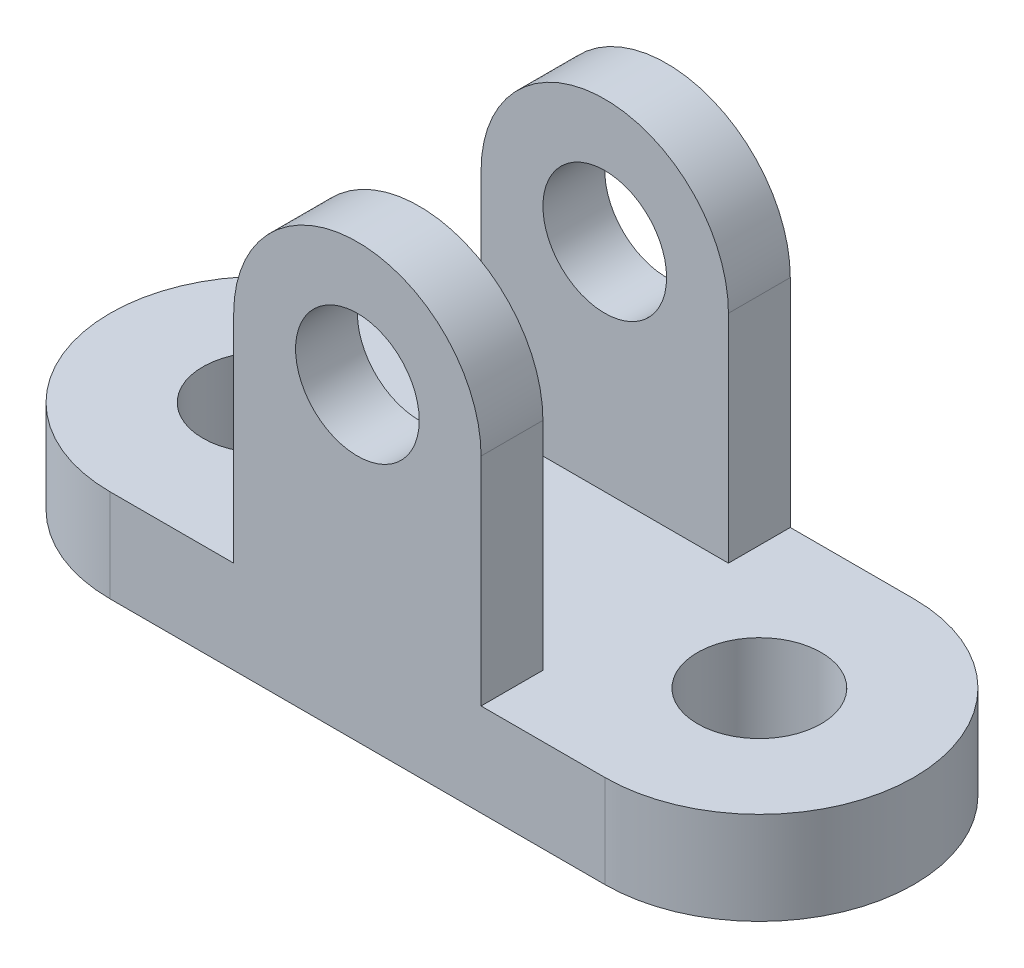
ISO-10303-21;
HEADER;
FILE_DESCRIPTION(('STEP AP214'),'2;1');
FILE_NAME('part.step','',(''),(''),'','','');
FILE_SCHEMA(('AUTOMOTIVE_DESIGN { 1 0 10303 214 1 1 1 1 }'));
ENDSEC;
DATA;
#1=APPLICATION_CONTEXT('core data for automotive mechanical design processes');
#2=APPLICATION_PROTOCOL_DEFINITION('international standard','automotive_design',2000,#1);
#3=PRODUCT_CONTEXT('',#1,'mechanical');
#4=PRODUCT('Part','Part','',(#3));
#5=PRODUCT_RELATED_PRODUCT_CATEGORY('part','',(#4));
#6=PRODUCT_DEFINITION_FORMATION('','',#4);
#7=PRODUCT_DEFINITION_CONTEXT('part definition',#1,'design');
#8=PRODUCT_DEFINITION('design','',#6,#7);
#9=PRODUCT_DEFINITION_SHAPE('','',#8);
#10=(LENGTH_UNIT() NAMED_UNIT(*) SI_UNIT(.MILLI.,.METRE.));
#11=(NAMED_UNIT(*) PLANE_ANGLE_UNIT() SI_UNIT($,.RADIAN.));
#12=(NAMED_UNIT(*) SI_UNIT($,.STERADIAN.) SOLID_ANGLE_UNIT());
#13=UNCERTAINTY_MEASURE_WITH_UNIT(LENGTH_MEASURE(1.E-05),#10,'distance_accuracy_value','');
#14=(GEOMETRIC_REPRESENTATION_CONTEXT(3) GLOBAL_UNCERTAINTY_ASSIGNED_CONTEXT((#13)) GLOBAL_UNIT_ASSIGNED_CONTEXT((#10,
#11,#12)) REPRESENTATION_CONTEXT('',''));
#15=CARTESIAN_POINT('',(0.,0.,0.));
#16=DIRECTION('',(0.,0.,1.));
#17=DIRECTION('',(1.,0.,0.));
#18=AXIS2_PLACEMENT_3D('',#15,#16,#17);
#19=CARTESIAN_POINT('',(0.,50.,-25.));
#20=DIRECTION('',(0.,0.,-1.));
#21=DIRECTION('',(-1.,0.,0.));
#22=AXIS2_PLACEMENT_3D('',#19,#20,#21);
#23=CYLINDRICAL_SURFACE('',#22,20.);
#24=CARTESIAN_POINT('',(0.,50.,15.));
#25=DIRECTION('',(0.,0.,-1.));
#26=DIRECTION('',(-1.,0.,0.));
#27=AXIS2_PLACEMENT_3D('',#24,#25,#26);
#28=CIRCLE('',#27,20.);
#29=CARTESIAN_POINT('',(20.,50.,15.));
#30=VERTEX_POINT('',#29);
#31=CARTESIAN_POINT('',(-20.,50.,15.));
#32=VERTEX_POINT('',#31);
#33=EDGE_CURVE('E271',#30,#32,#28,.F.);
#34=ORIENTED_EDGE('',*,*,#33,.T.);
#35=DIRECTION('',(0.,0.,-1.));
#36=VECTOR('',#35,1.);
#37=CARTESIAN_POINT('',(-20.,50.,25.));
#38=LINE('',#37,#36);
#39=CARTESIAN_POINT('',(-20.,50.,25.));
#40=VERTEX_POINT('',#39);
#41=EDGE_CURVE('E227',#40,#32,#38,.T.);
#42=ORIENTED_EDGE('',*,*,#41,.F.);
#43=CARTESIAN_POINT('',(0.,50.,25.));
#44=DIRECTION('',(0.,0.,-1.));
#45=DIRECTION('',(-1.,0.,0.));
#46=AXIS2_PLACEMENT_3D('',#43,#44,#45);
#47=CIRCLE('',#46,20.);
#48=CARTESIAN_POINT('',(20.,50.,25.));
#49=VERTEX_POINT('',#48);
#50=EDGE_CURVE('E71',#49,#40,#47,.F.);
#51=ORIENTED_EDGE('',*,*,#50,.F.);
#52=DIRECTION('',(0.,0.,-1.));
#53=VECTOR('',#52,1.);
#54=CARTESIAN_POINT('',(20.,50.,25.));
#55=LINE('',#54,#53);
#56=EDGE_CURVE('E223',#30,#49,#55,.F.);
#57=ORIENTED_EDGE('',*,*,#56,.F.);
#58=EDGE_LOOP('',(#34,#42,#51,#57));
#59=FACE_BOUND('',#58,.T.);
#60=ADVANCED_FACE('F47',(#59),#23,.T.);
#61=CARTESIAN_POINT('',(0.,50.,-15.));
#62=DIRECTION('',(0.,0.,1.));
#63=DIRECTION('',(1.,0.,0.));
#64=AXIS2_PLACEMENT_3D('',#61,#62,#63);
#65=CIRCLE('',#64,20.);
#66=CARTESIAN_POINT('',(-20.,50.,-15.));
#67=VERTEX_POINT('',#66);
#68=CARTESIAN_POINT('',(20.,50.,-15.));
#69=VERTEX_POINT('',#68);
#70=EDGE_CURVE('E148',#67,#69,#65,.F.);
#71=ORIENTED_EDGE('',*,*,#70,.T.);
#72=CARTESIAN_POINT('',(20.,50.,-25.));
#73=VERTEX_POINT('',#72);
#74=EDGE_CURVE('E156',#73,#69,#55,.F.);
#75=ORIENTED_EDGE('',*,*,#74,.F.);
#76=CARTESIAN_POINT('',(0.,50.,-25.));
#77=DIRECTION('',(0.,0.,1.));
#78=DIRECTION('',(1.,0.,0.));
#79=AXIS2_PLACEMENT_3D('',#76,#77,#78);
#80=CIRCLE('',#79,20.);
#81=CARTESIAN_POINT('',(-20.,50.,-25.));
#82=VERTEX_POINT('',#81);
#83=EDGE_CURVE('E231',#82,#73,#80,.F.);
#84=ORIENTED_EDGE('',*,*,#83,.F.);
#85=EDGE_CURVE('E226',#67,#82,#38,.T.);
#86=ORIENTED_EDGE('',*,*,#85,.F.);
#87=EDGE_LOOP('',(#71,#75,#84,#86));
#88=FACE_BOUND('',#87,.T.);
#89=ADVANCED_FACE('F325',(#88),#23,.T.);
#90=CARTESIAN_POINT('',(-20.,70.,25.));
#91=DIRECTION('',(1.,0.,0.));
#92=DIRECTION('',(0.,1.,0.));
#93=AXIS2_PLACEMENT_3D('',#90,#91,#92);
#94=PLANE('',#93);
#95=DIRECTION('',(0.,1.,0.));
#96=VECTOR('',#95,1.);
#97=CARTESIAN_POINT('',(-20.,70.,15.));
#98=LINE('',#97,#96);
#99=CARTESIAN_POINT('',(-20.,15.,15.));
#100=VERTEX_POINT('',#99);
#101=EDGE_CURVE('E251',#100,#32,#98,.T.);
#102=ORIENTED_EDGE('',*,*,#101,.F.);
#103=DIRECTION('',(0.,0.,-1.));
#104=VECTOR('',#103,1.);
#105=CARTESIAN_POINT('',(-20.,15.,25.));
#106=LINE('',#105,#104);
#107=CARTESIAN_POINT('',(-20.,15.,25.));
#108=VERTEX_POINT('',#107);
#109=EDGE_CURVE('E177',#108,#100,#106,.T.);
#110=ORIENTED_EDGE('',*,*,#109,.F.);
#111=DIRECTION('',(0.,-1.,0.));
#112=VECTOR('',#111,1.);
#113=CARTESIAN_POINT('',(-20.,70.,25.));
#114=LINE('',#113,#112);
#115=EDGE_CURVE('E171',#40,#108,#114,.T.);
#116=ORIENTED_EDGE('',*,*,#115,.F.);
#117=ORIENTED_EDGE('',*,*,#41,.T.);
#118=EDGE_LOOP('',(#102,#110,#116,#117));
#119=FACE_BOUND('',#118,.T.);
#120=ADVANCED_FACE('F267',(#119),#94,.F.);
#121=DIRECTION('',(0.,-1.,0.));
#122=VECTOR('',#121,1.);
#123=CARTESIAN_POINT('',(-20.,70.,-15.));
#124=LINE('',#123,#122);
#125=CARTESIAN_POINT('',(-20.,15.,-15.));
#126=VERTEX_POINT('',#125);
#127=EDGE_CURVE('E144',#67,#126,#124,.T.);
#128=ORIENTED_EDGE('',*,*,#127,.F.);
#129=ORIENTED_EDGE('',*,*,#85,.T.);
#130=DIRECTION('',(0.,-1.,0.));
#131=VECTOR('',#130,1.);
#132=CARTESIAN_POINT('',(-20.,70.,-25.));
#133=LINE('',#132,#131);
#134=CARTESIAN_POINT('',(-20.,15.,-25.));
#135=VERTEX_POINT('',#134);
#136=EDGE_CURVE('E245',#82,#135,#133,.T.);
#137=ORIENTED_EDGE('',*,*,#136,.T.);
#138=EDGE_CURVE('E170',#126,#135,#106,.T.);
#139=ORIENTED_EDGE('',*,*,#138,.F.);
#140=EDGE_LOOP('',(#128,#129,#137,#139));
#141=FACE_BOUND('',#140,.T.);
#142=ADVANCED_FACE('F246',(#141),#94,.F.);
#143=CARTESIAN_POINT('',(20.,70.,25.));
#144=DIRECTION('',(-1.,0.,0.));
#145=DIRECTION('',(0.,-1.,0.));
#146=AXIS2_PLACEMENT_3D('',#143,#144,#145);
#147=PLANE('',#146);
#148=DIRECTION('',(0.,-1.,0.));
#149=VECTOR('',#148,1.);
#150=CARTESIAN_POINT('',(20.,70.,15.));
#151=LINE('',#150,#149);
#152=CARTESIAN_POINT('',(20.,15.,15.));
#153=VERTEX_POINT('',#152);
#154=EDGE_CURVE('E11',#30,#153,#151,.T.);
#155=ORIENTED_EDGE('',*,*,#154,.F.);
#156=ORIENTED_EDGE('',*,*,#56,.T.);
#157=DIRECTION('',(0.,1.,0.));
#158=VECTOR('',#157,1.);
#159=CARTESIAN_POINT('',(20.,70.,25.));
#160=LINE('',#159,#158);
#161=CARTESIAN_POINT('',(20.,15.,25.));
#162=VERTEX_POINT('',#161);
#163=EDGE_CURVE('E165',#162,#49,#160,.T.);
#164=ORIENTED_EDGE('',*,*,#163,.F.);
#165=DIRECTION('',(0.,0.,-1.));
#166=VECTOR('',#165,1.);
#167=CARTESIAN_POINT('',(20.,15.,25.));
#168=LINE('',#167,#166);
#169=EDGE_CURVE('E164',#162,#153,#168,.T.);
#170=ORIENTED_EDGE('',*,*,#169,.T.);
#171=EDGE_LOOP('',(#155,#156,#164,#170));
#172=FACE_BOUND('',#171,.T.);
#173=ADVANCED_FACE('F335',(#172),#147,.F.);
#174=DIRECTION('',(0.,1.,0.));
#175=VECTOR('',#174,1.);
#176=CARTESIAN_POINT('',(20.,70.,-15.));
#177=LINE('',#176,#175);
#178=CARTESIAN_POINT('',(20.,15.,-15.));
#179=VERTEX_POINT('',#178);
#180=EDGE_CURVE('E57',#179,#69,#177,.T.);
#181=ORIENTED_EDGE('',*,*,#180,.F.);
#182=CARTESIAN_POINT('',(20.,15.,-25.));
#183=VERTEX_POINT('',#182);
#184=EDGE_CURVE('E153',#179,#183,#168,.T.);
#185=ORIENTED_EDGE('',*,*,#184,.T.);
#186=DIRECTION('',(0.,1.,0.));
#187=VECTOR('',#186,1.);
#188=CARTESIAN_POINT('',(20.,70.,-25.));
#189=LINE('',#188,#187);
#190=EDGE_CURVE('E175',#183,#73,#189,.T.);
#191=ORIENTED_EDGE('',*,*,#190,.T.);
#192=ORIENTED_EDGE('',*,*,#74,.T.);
#193=EDGE_LOOP('',(#181,#185,#191,#192));
#194=FACE_BOUND('',#193,.T.);
#195=ADVANCED_FACE('F151',(#194),#147,.F.);
#196=CARTESIAN_POINT('',(-40.,15.,0.));
#197=DIRECTION('',(0.,-1.,0.));
#198=DIRECTION('',(0.,0.,-1.));
#199=AXIS2_PLACEMENT_3D('',#196,#197,#198);
#200=CYLINDRICAL_SURFACE('',#199,25.);
#201=CARTESIAN_POINT('',(-40.,0.,0.));
#202=DIRECTION('',(0.,1.,0.));
#203=DIRECTION('',(0.,0.,1.));
#204=AXIS2_PLACEMENT_3D('',#201,#202,#203);
#205=CIRCLE('',#204,25.);
#206=CARTESIAN_POINT('',(-40.,0.,-25.));
#207=VERTEX_POINT('',#206);
#208=CARTESIAN_POINT('',(-40.,0.,25.));
#209=VERTEX_POINT('',#208);
#210=EDGE_CURVE('E180',#207,#209,#205,.T.);
#211=ORIENTED_EDGE('',*,*,#210,.T.);
#212=DIRECTION('',(0.,-1.,0.));
#213=VECTOR('',#212,1.);
#214=CARTESIAN_POINT('',(-40.,15.,25.));
#215=LINE('',#214,#213);
#216=CARTESIAN_POINT('',(-40.,15.,25.));
#217=VERTEX_POINT('',#216);
#218=EDGE_CURVE('E219',#217,#209,#215,.T.);
#219=ORIENTED_EDGE('',*,*,#218,.F.);
#220=CARTESIAN_POINT('',(-40.,15.,0.));
#221=DIRECTION('',(0.,1.,0.));
#222=DIRECTION('',(0.,0.,1.));
#223=AXIS2_PLACEMENT_3D('',#220,#221,#222);
#224=CIRCLE('',#223,25.);
#225=CARTESIAN_POINT('',(-40.,15.,-25.));
#226=VERTEX_POINT('',#225);
#227=EDGE_CURVE('E181',#226,#217,#224,.T.);
#228=ORIENTED_EDGE('',*,*,#227,.F.);
#229=DIRECTION('',(0.,-1.,0.));
#230=VECTOR('',#229,1.);
#231=CARTESIAN_POINT('',(-40.,15.,-25.));
#232=LINE('',#231,#230);
#233=EDGE_CURVE('E196',#226,#207,#232,.T.);
#234=ORIENTED_EDGE('',*,*,#233,.T.);
#235=EDGE_LOOP('',(#211,#219,#228,#234));
#236=FACE_BOUND('',#235,.T.);
#237=ADVANCED_FACE('F258',(#236),#200,.T.);
#238=CARTESIAN_POINT('',(-40.,15.,25.));
#239=DIRECTION('',(0.,0.,-1.));
#240=DIRECTION('',(-1.,0.,0.));
#241=AXIS2_PLACEMENT_3D('',#238,#239,#240);
#242=PLANE('',#241);
#243=CARTESIAN_POINT('',(0.,50.,25.));
#244=DIRECTION('',(0.,0.,1.));
#245=DIRECTION('',(1.,0.,0.));
#246=AXIS2_PLACEMENT_3D('',#243,#244,#245);
#247=CIRCLE('',#246,9.99999999999999);
#248=CARTESIAN_POINT('',(9.99999999999998,50.,25.));
#249=VERTEX_POINT('',#248);
#250=EDGE_CURVE('E306',#249,#249,#247,.T.);
#251=ORIENTED_EDGE('',*,*,#250,.F.);
#252=EDGE_LOOP('',(#251));
#253=FACE_BOUND('',#252,.T.);
#254=ORIENTED_EDGE('',*,*,#163,.T.);
#255=ORIENTED_EDGE('',*,*,#50,.T.);
#256=ORIENTED_EDGE('',*,*,#115,.T.);
#257=DIRECTION('',(1.,0.,0.));
#258=VECTOR('',#257,1.);
#259=CARTESIAN_POINT('',(-40.,15.,25.));
#260=LINE('',#259,#258);
#261=EDGE_CURVE('E186',#217,#108,#260,.T.);
#262=ORIENTED_EDGE('',*,*,#261,.F.);
#263=ORIENTED_EDGE('',*,*,#218,.T.);
#264=DIRECTION('',(1.,0.,0.));
#265=VECTOR('',#264,1.);
#266=CARTESIAN_POINT('',(-40.,0.,25.));
#267=LINE('',#266,#265);
#268=CARTESIAN_POINT('',(40.,0.,25.));
#269=VERTEX_POINT('',#268);
#270=EDGE_CURVE('E200',#209,#269,#267,.T.);
#271=ORIENTED_EDGE('',*,*,#270,.T.);
#272=DIRECTION('',(0.,-1.,0.));
#273=VECTOR('',#272,1.);
#274=CARTESIAN_POINT('',(40.,15.,25.));
#275=LINE('',#274,#273);
#276=CARTESIAN_POINT('',(40.,15.,25.));
#277=VERTEX_POINT('',#276);
#278=EDGE_CURVE('E215',#277,#269,#275,.T.);
#279=ORIENTED_EDGE('',*,*,#278,.F.);
#280=EDGE_CURVE('E184',#162,#277,#260,.T.);
#281=ORIENTED_EDGE('',*,*,#280,.F.);
#282=EDGE_LOOP('',(#254,#255,#256,#262,#263,#271,#279,#281));
#283=FACE_BOUND('',#282,.T.);
#284=ADVANCED_FACE('F260',(#253,#283),#242,.F.);
#285=CARTESIAN_POINT('',(40.,15.,0.));
#286=DIRECTION('',(0.,-1.,0.));
#287=DIRECTION('',(0.,0.,-1.));
#288=AXIS2_PLACEMENT_3D('',#285,#286,#287);
#289=CYLINDRICAL_SURFACE('',#288,25.);
#290=CARTESIAN_POINT('',(40.,0.,0.));
#291=DIRECTION('',(0.,1.,0.));
#292=DIRECTION('',(0.,0.,1.));
#293=AXIS2_PLACEMENT_3D('',#290,#291,#292);
#294=CIRCLE('',#293,25.);
#295=CARTESIAN_POINT('',(40.,0.,-25.));
#296=VERTEX_POINT('',#295);
#297=EDGE_CURVE('E203',#269,#296,#294,.T.);
#298=ORIENTED_EDGE('',*,*,#297,.T.);
#299=DIRECTION('',(0.,-1.,0.));
#300=VECTOR('',#299,1.);
#301=CARTESIAN_POINT('',(40.,15.,-25.));
#302=LINE('',#301,#300);
#303=CARTESIAN_POINT('',(40.,15.,-25.));
#304=VERTEX_POINT('',#303);
#305=EDGE_CURVE('E211',#304,#296,#302,.T.);
#306=ORIENTED_EDGE('',*,*,#305,.F.);
#307=CARTESIAN_POINT('',(40.,15.,0.));
#308=DIRECTION('',(0.,1.,0.));
#309=DIRECTION('',(0.,0.,1.));
#310=AXIS2_PLACEMENT_3D('',#307,#308,#309);
#311=CIRCLE('',#310,25.);
#312=EDGE_CURVE('E190',#277,#304,#311,.T.);
#313=ORIENTED_EDGE('',*,*,#312,.F.);
#314=ORIENTED_EDGE('',*,*,#278,.T.);
#315=EDGE_LOOP('',(#298,#306,#313,#314));
#316=FACE_BOUND('',#315,.T.);
#317=ADVANCED_FACE('F314',(#316),#289,.T.);
#318=CARTESIAN_POINT('',(-40.,15.,-25.));
#319=DIRECTION('',(0.,0.,1.));
#320=DIRECTION('',(1.,0.,0.));
#321=AXIS2_PLACEMENT_3D('',#318,#319,#320);
#322=PLANE('',#321);
#323=CARTESIAN_POINT('',(0.,50.,-25.));
#324=DIRECTION('',(0.,0.,1.));
#325=DIRECTION('',(1.,0.,0.));
#326=AXIS2_PLACEMENT_3D('',#323,#324,#325);
#327=CIRCLE('',#326,9.99999999999999);
#328=CARTESIAN_POINT('',(9.99999999999999,50.,-25.));
#329=VERTEX_POINT('',#328);
#330=EDGE_CURVE('E302',#329,#329,#327,.T.);
#331=ORIENTED_EDGE('',*,*,#330,.T.);
#332=EDGE_LOOP('',(#331));
#333=FACE_BOUND('',#332,.T.);
#334=ORIENTED_EDGE('',*,*,#136,.F.);
#335=ORIENTED_EDGE('',*,*,#83,.T.);
#336=ORIENTED_EDGE('',*,*,#190,.F.);
#337=DIRECTION('',(-1.,0.,0.));
#338=VECTOR('',#337,1.);
#339=CARTESIAN_POINT('',(-40.,15.,-25.));
#340=LINE('',#339,#338);
#341=EDGE_CURVE('E162',#304,#183,#340,.T.);
#342=ORIENTED_EDGE('',*,*,#341,.F.);
#343=ORIENTED_EDGE('',*,*,#305,.T.);
#344=DIRECTION('',(-1.,0.,0.));
#345=VECTOR('',#344,1.);
#346=CARTESIAN_POINT('',(-40.,0.,-25.));
#347=LINE('',#346,#345);
#348=EDGE_CURVE('E185',#296,#207,#347,.T.);
#349=ORIENTED_EDGE('',*,*,#348,.T.);
#350=ORIENTED_EDGE('',*,*,#233,.F.);
#351=EDGE_CURVE('E193',#135,#226,#340,.T.);
#352=ORIENTED_EDGE('',*,*,#351,.F.);
#353=EDGE_LOOP('',(#334,#335,#336,#342,#343,#349,#350,#352));
#354=FACE_BOUND('',#353,.T.);
#355=ADVANCED_FACE('F252',(#333,#354),#322,.F.);
#356=CARTESIAN_POINT('',(-40.,15.,0.));
#357=DIRECTION('',(0.,1.,0.));
#358=DIRECTION('',(0.,0.,1.));
#359=AXIS2_PLACEMENT_3D('',#356,#357,#358);
#360=PLANE('',#359);
#361=CARTESIAN_POINT('',(-40.,15.,0.));
#362=DIRECTION('',(0.,1.,0.));
#363=DIRECTION('',(0.,0.,1.));
#364=AXIS2_PLACEMENT_3D('',#361,#362,#363);
#365=CIRCLE('',#364,10.);
#366=CARTESIAN_POINT('',(-40.,15.,10.));
#367=VERTEX_POINT('',#366);
#368=EDGE_CURVE('E294',#367,#367,#365,.T.);
#369=ORIENTED_EDGE('',*,*,#368,.F.);
#370=EDGE_LOOP('',(#369));
#371=FACE_BOUND('',#370,.T.);
#372=CARTESIAN_POINT('',(40.,15.,0.));
#373=DIRECTION('',(0.,1.,0.));
#374=DIRECTION('',(0.,0.,1.));
#375=AXIS2_PLACEMENT_3D('',#372,#373,#374);
#376=CIRCLE('',#375,10.);
#377=CARTESIAN_POINT('',(40.,15.,10.));
#378=VERTEX_POINT('',#377);
#379=EDGE_CURVE('E286',#378,#378,#376,.T.);
#380=ORIENTED_EDGE('',*,*,#379,.F.);
#381=EDGE_LOOP('',(#380));
#382=FACE_BOUND('',#381,.T.);
#383=DIRECTION('',(1.,0.,0.));
#384=VECTOR('',#383,1.);
#385=CARTESIAN_POINT('',(-80.5532410933022,15.,15.));
#386=LINE('',#385,#384);
#387=EDGE_CURVE('E64',#100,#153,#386,.T.);
#388=ORIENTED_EDGE('',*,*,#387,.T.);
#389=ORIENTED_EDGE('',*,*,#169,.F.);
#390=ORIENTED_EDGE('',*,*,#280,.T.);
#391=ORIENTED_EDGE('',*,*,#312,.T.);
#392=ORIENTED_EDGE('',*,*,#341,.T.);
#393=ORIENTED_EDGE('',*,*,#184,.F.);
#394=DIRECTION('',(-1.,0.,0.));
#395=VECTOR('',#394,1.);
#396=CARTESIAN_POINT('',(-80.5532410933022,15.,-15.));
#397=LINE('',#396,#395);
#398=EDGE_CURVE('E139',#179,#126,#397,.T.);
#399=ORIENTED_EDGE('',*,*,#398,.T.);
#400=ORIENTED_EDGE('',*,*,#138,.T.);
#401=ORIENTED_EDGE('',*,*,#351,.T.);
#402=ORIENTED_EDGE('',*,*,#227,.T.);
#403=ORIENTED_EDGE('',*,*,#261,.T.);
#404=ORIENTED_EDGE('',*,*,#109,.T.);
#405=EDGE_LOOP('',(#388,#389,#390,#391,#392,#393,#399,#400,#401,#402,#403,#404));
#406=FACE_BOUND('',#405,.T.);
#407=ADVANCED_FACE('F160',(#371,#382,#406),#360,.T.);
#408=CARTESIAN_POINT('',(-40.,0.,0.));
#409=DIRECTION('',(0.,1.,0.));
#410=DIRECTION('',(0.,0.,1.));
#411=AXIS2_PLACEMENT_3D('',#408,#409,#410);
#412=PLANE('',#411);
#413=CARTESIAN_POINT('',(-40.,0.,0.));
#414=DIRECTION('',(0.,1.,0.));
#415=DIRECTION('',(0.,0.,1.));
#416=AXIS2_PLACEMENT_3D('',#413,#414,#415);
#417=CIRCLE('',#416,9.99999999999999);
#418=CARTESIAN_POINT('',(-40.,0.,9.99999999999999));
#419=VERTEX_POINT('',#418);
#420=EDGE_CURVE('E290',#419,#419,#417,.T.);
#421=ORIENTED_EDGE('',*,*,#420,.T.);
#422=EDGE_LOOP('',(#421));
#423=FACE_BOUND('',#422,.T.);
#424=CARTESIAN_POINT('',(40.,0.,0.));
#425=DIRECTION('',(0.,1.,0.));
#426=DIRECTION('',(0.,0.,1.));
#427=AXIS2_PLACEMENT_3D('',#424,#425,#426);
#428=CIRCLE('',#427,9.99999999999999);
#429=CARTESIAN_POINT('',(40.,0.,9.99999999999999));
#430=VERTEX_POINT('',#429);
#431=EDGE_CURVE('E282',#430,#430,#428,.T.);
#432=ORIENTED_EDGE('',*,*,#431,.T.);
#433=EDGE_LOOP('',(#432));
#434=FACE_BOUND('',#433,.T.);
#435=ORIENTED_EDGE('',*,*,#210,.F.);
#436=ORIENTED_EDGE('',*,*,#348,.F.);
#437=ORIENTED_EDGE('',*,*,#297,.F.);
#438=ORIENTED_EDGE('',*,*,#270,.F.);
#439=EDGE_LOOP('',(#435,#436,#437,#438));
#440=FACE_BOUND('',#439,.T.);
#441=ADVANCED_FACE('F343',(#423,#434,#440),#412,.F.);
#442=CARTESIAN_POINT('',(-80.5532410933022,70.,15.));
#443=DIRECTION('',(0.,0.,-1.));
#444=DIRECTION('',(-1.,0.,0.));
#445=AXIS2_PLACEMENT_3D('',#442,#443,#444);
#446=PLANE('',#445);
#447=CARTESIAN_POINT('',(0.,50.,15.));
#448=DIRECTION('',(0.,0.,-1.));
#449=DIRECTION('',(-1.,0.,0.));
#450=AXIS2_PLACEMENT_3D('',#447,#448,#449);
#451=CIRCLE('',#450,9.99999999999999);
#452=CARTESIAN_POINT('',(-10.,50.,15.));
#453=VERTEX_POINT('',#452);
#454=EDGE_CURVE('E298',#453,#453,#451,.T.);
#455=ORIENTED_EDGE('',*,*,#454,.F.);
#456=EDGE_LOOP('',(#455));
#457=FACE_BOUND('',#456,.T.);
#458=ORIENTED_EDGE('',*,*,#101,.T.);
#459=ORIENTED_EDGE('',*,*,#33,.F.);
#460=ORIENTED_EDGE('',*,*,#154,.T.);
#461=ORIENTED_EDGE('',*,*,#387,.F.);
#462=EDGE_LOOP('',(#458,#459,#460,#461));
#463=FACE_BOUND('',#462,.T.);
#464=ADVANCED_FACE('F333',(#457,#463),#446,.T.);
#465=CARTESIAN_POINT('',(-80.5532410933022,70.,-15.));
#466=DIRECTION('',(0.,0.,1.));
#467=DIRECTION('',(1.,0.,0.));
#468=AXIS2_PLACEMENT_3D('',#465,#466,#467);
#469=PLANE('',#468);
#470=CARTESIAN_POINT('',(0.,50.,-15.));
#471=DIRECTION('',(0.,0.,1.));
#472=DIRECTION('',(1.,0.,0.));
#473=AXIS2_PLACEMENT_3D('',#470,#471,#472);
#474=CIRCLE('',#473,9.99999999999999);
#475=CARTESIAN_POINT('',(9.99999999999998,50.,-15.));
#476=VERTEX_POINT('',#475);
#477=EDGE_CURVE('E51',#476,#476,#474,.T.);
#478=ORIENTED_EDGE('',*,*,#477,.F.);
#479=EDGE_LOOP('',(#478));
#480=FACE_BOUND('',#479,.T.);
#481=ORIENTED_EDGE('',*,*,#127,.T.);
#482=ORIENTED_EDGE('',*,*,#398,.F.);
#483=ORIENTED_EDGE('',*,*,#180,.T.);
#484=ORIENTED_EDGE('',*,*,#70,.F.);
#485=EDGE_LOOP('',(#481,#482,#483,#484));
#486=FACE_BOUND('',#485,.T.);
#487=ADVANCED_FACE('F141',(#480,#486),#469,.T.);
#488=CARTESIAN_POINT('',(40.,15.,0.));
#489=DIRECTION('',(0.,1.,0.));
#490=DIRECTION('',(0.,0.,1.));
#491=AXIS2_PLACEMENT_3D('',#488,#489,#490);
#492=CYLINDRICAL_SURFACE('',#491,10.);
#493=ORIENTED_EDGE('',*,*,#431,.F.);
#494=EDGE_LOOP('',(#493));
#495=FACE_BOUND('',#494,.T.);
#496=ORIENTED_EDGE('',*,*,#379,.T.);
#497=EDGE_LOOP('',(#496));
#498=FACE_BOUND('',#497,.T.);
#499=ADVANCED_FACE('F374',(#495,#498),#492,.F.);
#500=CARTESIAN_POINT('',(-40.,15.,0.));
#501=DIRECTION('',(0.,1.,0.));
#502=DIRECTION('',(0.,0.,1.));
#503=AXIS2_PLACEMENT_3D('',#500,#501,#502);
#504=CYLINDRICAL_SURFACE('',#503,10.);
#505=ORIENTED_EDGE('',*,*,#420,.F.);
#506=EDGE_LOOP('',(#505));
#507=FACE_BOUND('',#506,.T.);
#508=ORIENTED_EDGE('',*,*,#368,.T.);
#509=EDGE_LOOP('',(#508));
#510=FACE_BOUND('',#509,.T.);
#511=ADVANCED_FACE('F366',(#507,#510),#504,.F.);
#512=CARTESIAN_POINT('',(0.,50.,25.));
#513=DIRECTION('',(0.,0.,1.));
#514=DIRECTION('',(1.,0.,0.));
#515=AXIS2_PLACEMENT_3D('',#512,#513,#514);
#516=CYLINDRICAL_SURFACE('',#515,9.99999999999999);
#517=ORIENTED_EDGE('',*,*,#477,.T.);
#518=EDGE_LOOP('',(#517));
#519=FACE_BOUND('',#518,.T.);
#520=ORIENTED_EDGE('',*,*,#330,.F.);
#521=EDGE_LOOP('',(#520));
#522=FACE_BOUND('',#521,.T.);
#523=ADVANCED_FACE('F364',(#519,#522),#516,.F.);
#524=ORIENTED_EDGE('',*,*,#454,.T.);
#525=EDGE_LOOP('',(#524));
#526=FACE_BOUND('',#525,.T.);
#527=ORIENTED_EDGE('',*,*,#250,.T.);
#528=EDGE_LOOP('',(#527));
#529=FACE_BOUND('',#528,.T.);
#530=ADVANCED_FACE('F311',(#526,#529),#516,.F.);
#531=CLOSED_SHELL('',(#60,#89,#120,#142,#173,#195,#237,#284,#317,#355,#407,#441,#464,#487,#499,
#511,#523,#530));
#532=MANIFOLD_SOLID_BREP('B2',#531);
#533=ADVANCED_BREP_SHAPE_REPRESENTATION('',(#18,#532),#14);
#534=SHAPE_DEFINITION_REPRESENTATION(#9,#533);
ENDSEC;
END-ISO-10303-21;
